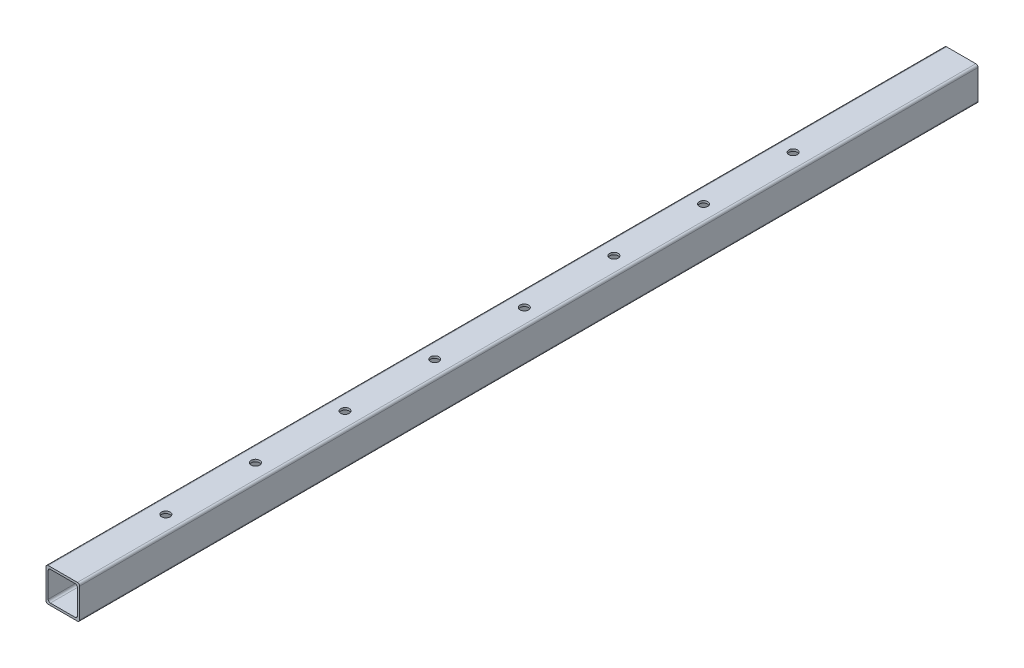
ISO-10303-21;
HEADER;
FILE_DESCRIPTION(('STEP AP214'),'2;1');
FILE_NAME('part.step','',(''),(''),'','','');
FILE_SCHEMA(('AUTOMOTIVE_DESIGN { 1 0 10303 214 1 1 1 1 }'));
ENDSEC;
DATA;
#1=APPLICATION_CONTEXT('core data for automotive mechanical design processes');
#2=APPLICATION_PROTOCOL_DEFINITION('international standard','automotive_design',2000,#1);
#3=PRODUCT_CONTEXT('',#1,'mechanical');
#4=PRODUCT('Part','Part','',(#3));
#5=PRODUCT_RELATED_PRODUCT_CATEGORY('part','',(#4));
#6=PRODUCT_DEFINITION_FORMATION('','',#4);
#7=PRODUCT_DEFINITION_CONTEXT('part definition',#1,'design');
#8=PRODUCT_DEFINITION('design','',#6,#7);
#9=PRODUCT_DEFINITION_SHAPE('','',#8);
#10=(LENGTH_UNIT() NAMED_UNIT(*) SI_UNIT(.MILLI.,.METRE.));
#11=(NAMED_UNIT(*) PLANE_ANGLE_UNIT() SI_UNIT($,.RADIAN.));
#12=(NAMED_UNIT(*) SI_UNIT($,.STERADIAN.) SOLID_ANGLE_UNIT());
#13=UNCERTAINTY_MEASURE_WITH_UNIT(LENGTH_MEASURE(1.E-05),#10,'distance_accuracy_value','');
#14=(GEOMETRIC_REPRESENTATION_CONTEXT(3) GLOBAL_UNCERTAINTY_ASSIGNED_CONTEXT((#13)) GLOBAL_UNIT_ASSIGNED_CONTEXT((#10,
#11,#12)) REPRESENTATION_CONTEXT('',''));
#15=CARTESIAN_POINT('',(0.,0.,0.));
#16=DIRECTION('',(0.,0.,1.));
#17=DIRECTION('',(1.,0.,0.));
#18=AXIS2_PLACEMENT_3D('',#15,#16,#17);
#19=CARTESIAN_POINT('',(0.,0.,254.635));
#20=DIRECTION('',(0.,0.,1.));
#21=DIRECTION('',(1.,0.,0.));
#22=AXIS2_PLACEMENT_3D('',#19,#20,#21);
#23=PLANE('',#22);
#24=DIRECTION('',(-1.,0.,0.));
#25=VECTOR('',#24,1.);
#26=CARTESIAN_POINT('',(9.525,9.525,254.635));
#27=LINE('',#26,#25);
#28=CARTESIAN_POINT('',(8.2804,9.525,254.635));
#29=VERTEX_POINT('',#28);
#30=CARTESIAN_POINT('',(-8.28039999999999,9.525,254.635));
#31=VERTEX_POINT('',#30);
#32=EDGE_CURVE('E296',#29,#31,#27,.T.);
#33=ORIENTED_EDGE('',*,*,#32,.T.);
#34=CARTESIAN_POINT('',(-8.2804,8.2804,254.635));
#35=DIRECTION('',(0.,0.,1.));
#36=DIRECTION('',(1.,0.,0.));
#37=AXIS2_PLACEMENT_3D('',#34,#35,#36);
#38=CIRCLE('',#37,1.2446);
#39=CARTESIAN_POINT('',(-9.525,8.2804,254.635));
#40=VERTEX_POINT('',#39);
#41=EDGE_CURVE('E215',#31,#40,#38,.T.);
#42=ORIENTED_EDGE('',*,*,#41,.T.);
#43=DIRECTION('',(0.,-1.,0.));
#44=VECTOR('',#43,1.);
#45=CARTESIAN_POINT('',(-9.525,9.525,254.635));
#46=LINE('',#45,#44);
#47=CARTESIAN_POINT('',(-9.525,-8.2804,254.635));
#48=VERTEX_POINT('',#47);
#49=EDGE_CURVE('E183',#40,#48,#46,.T.);
#50=ORIENTED_EDGE('',*,*,#49,.T.);
#51=CARTESIAN_POINT('',(-8.2804,-8.2804,254.635));
#52=DIRECTION('',(0.,0.,1.));
#53=DIRECTION('',(1.,0.,0.));
#54=AXIS2_PLACEMENT_3D('',#51,#52,#53);
#55=CIRCLE('',#54,1.2446);
#56=CARTESIAN_POINT('',(-8.2804,-9.525,254.635));
#57=VERTEX_POINT('',#56);
#58=EDGE_CURVE('E211',#48,#57,#55,.T.);
#59=ORIENTED_EDGE('',*,*,#58,.T.);
#60=DIRECTION('',(1.,0.,0.));
#61=VECTOR('',#60,1.);
#62=CARTESIAN_POINT('',(-9.525,-9.525,254.635));
#63=LINE('',#62,#61);
#64=CARTESIAN_POINT('',(8.28039999999999,-9.525,254.635));
#65=VERTEX_POINT('',#64);
#66=EDGE_CURVE('E201',#57,#65,#63,.T.);
#67=ORIENTED_EDGE('',*,*,#66,.T.);
#68=CARTESIAN_POINT('',(8.2804,-8.2804,254.635));
#69=DIRECTION('',(0.,0.,1.));
#70=DIRECTION('',(1.,0.,0.));
#71=AXIS2_PLACEMENT_3D('',#68,#69,#70);
#72=CIRCLE('',#71,1.2446);
#73=CARTESIAN_POINT('',(9.525,-8.2804,254.635));
#74=VERTEX_POINT('',#73);
#75=EDGE_CURVE('E213',#65,#74,#72,.T.);
#76=ORIENTED_EDGE('',*,*,#75,.T.);
#77=DIRECTION('',(0.,1.,0.));
#78=VECTOR('',#77,1.);
#79=CARTESIAN_POINT('',(9.525,-9.525,254.635));
#80=LINE('',#79,#78);
#81=CARTESIAN_POINT('',(9.525,8.2804,254.635));
#82=VERTEX_POINT('',#81);
#83=EDGE_CURVE('E195',#74,#82,#80,.T.);
#84=ORIENTED_EDGE('',*,*,#83,.T.);
#85=CARTESIAN_POINT('',(8.2804,8.2804,254.635));
#86=DIRECTION('',(0.,0.,1.));
#87=DIRECTION('',(1.,0.,0.));
#88=AXIS2_PLACEMENT_3D('',#85,#86,#87);
#89=CIRCLE('',#88,1.2446);
#90=EDGE_CURVE('E209',#82,#29,#89,.T.);
#91=ORIENTED_EDGE('',*,*,#90,.T.);
#92=EDGE_LOOP('',(#33,#42,#50,#59,#67,#76,#84,#91));
#93=FACE_BOUND('',#92,.T.);
#94=DIRECTION('',(0.,1.,0.));
#95=VECTOR('',#94,1.);
#96=CARTESIAN_POINT('',(8.2804,8.2804,254.635));
#97=LINE('',#96,#95);
#98=CARTESIAN_POINT('',(8.2804,-7.0358,254.635));
#99=VERTEX_POINT('',#98);
#100=CARTESIAN_POINT('',(8.2804,7.0358,254.635));
#101=VERTEX_POINT('',#100);
#102=EDGE_CURVE('E272',#99,#101,#97,.T.);
#103=ORIENTED_EDGE('',*,*,#102,.F.);
#104=CARTESIAN_POINT('',(7.0358,-7.0358,254.635));
#105=DIRECTION('',(0.,0.,1.));
#106=DIRECTION('',(1.,0.,0.));
#107=AXIS2_PLACEMENT_3D('',#104,#105,#106);
#108=CIRCLE('',#107,1.2446);
#109=CARTESIAN_POINT('',(7.0358,-8.2804,254.635));
#110=VERTEX_POINT('',#109);
#111=EDGE_CURVE('E248',#99,#110,#108,.F.);
#112=ORIENTED_EDGE('',*,*,#111,.T.);
#113=DIRECTION('',(1.,0.,0.));
#114=VECTOR('',#113,1.);
#115=CARTESIAN_POINT('',(8.2804,-8.2804,254.635));
#116=LINE('',#115,#114);
#117=CARTESIAN_POINT('',(-7.0358,-8.2804,254.635));
#118=VERTEX_POINT('',#117);
#119=EDGE_CURVE('E278',#118,#110,#116,.T.);
#120=ORIENTED_EDGE('',*,*,#119,.F.);
#121=CARTESIAN_POINT('',(-7.0358,-7.0358,254.635));
#122=DIRECTION('',(0.,0.,1.));
#123=DIRECTION('',(1.,0.,0.));
#124=AXIS2_PLACEMENT_3D('',#121,#122,#123);
#125=CIRCLE('',#124,1.2446);
#126=CARTESIAN_POINT('',(-8.2804,-7.0358,254.635));
#127=VERTEX_POINT('',#126);
#128=EDGE_CURVE('E252',#118,#127,#125,.F.);
#129=ORIENTED_EDGE('',*,*,#128,.T.);
#130=DIRECTION('',(0.,-1.,0.));
#131=VECTOR('',#130,1.);
#132=CARTESIAN_POINT('',(-8.2804,-8.2804,254.635));
#133=LINE('',#132,#131);
#134=CARTESIAN_POINT('',(-8.2804,7.0358,254.635));
#135=VERTEX_POINT('',#134);
#136=EDGE_CURVE('E280',#135,#127,#133,.T.);
#137=ORIENTED_EDGE('',*,*,#136,.F.);
#138=CARTESIAN_POINT('',(-7.0358,7.0358,254.635));
#139=DIRECTION('',(0.,0.,1.));
#140=DIRECTION('',(1.,0.,0.));
#141=AXIS2_PLACEMENT_3D('',#138,#139,#140);
#142=CIRCLE('',#141,1.2446);
#143=CARTESIAN_POINT('',(-7.0358,8.2804,254.635));
#144=VERTEX_POINT('',#143);
#145=EDGE_CURVE('E64',#135,#144,#142,.F.);
#146=ORIENTED_EDGE('',*,*,#145,.T.);
#147=DIRECTION('',(-1.,0.,0.));
#148=VECTOR('',#147,1.);
#149=CARTESIAN_POINT('',(-8.2804,8.2804,254.635));
#150=LINE('',#149,#148);
#151=CARTESIAN_POINT('',(7.0358,8.2804,254.635));
#152=VERTEX_POINT('',#151);
#153=EDGE_CURVE('E274',#152,#144,#150,.T.);
#154=ORIENTED_EDGE('',*,*,#153,.F.);
#155=CARTESIAN_POINT('',(7.0358,7.0358,254.635));
#156=DIRECTION('',(0.,0.,1.));
#157=DIRECTION('',(1.,0.,0.));
#158=AXIS2_PLACEMENT_3D('',#155,#156,#157);
#159=CIRCLE('',#158,1.2446);
#160=EDGE_CURVE('E11',#152,#101,#159,.F.);
#161=ORIENTED_EDGE('',*,*,#160,.T.);
#162=EDGE_LOOP('',(#103,#112,#120,#129,#137,#146,#154,#161));
#163=FACE_BOUND('',#162,.T.);
#164=ADVANCED_FACE('F49',(#93,#163),#23,.T.);
#165=CARTESIAN_POINT('',(0.,0.,-254.635));
#166=DIRECTION('',(0.,0.,1.));
#167=DIRECTION('',(1.,0.,0.));
#168=AXIS2_PLACEMENT_3D('',#165,#166,#167);
#169=PLANE('',#168);
#170=DIRECTION('',(0.,-1.,0.));
#171=VECTOR('',#170,1.);
#172=CARTESIAN_POINT('',(-9.525,9.525,-254.635));
#173=LINE('',#172,#171);
#174=CARTESIAN_POINT('',(-9.525,8.2804,-254.635));
#175=VERTEX_POINT('',#174);
#176=CARTESIAN_POINT('',(-9.525,-8.2804,-254.635));
#177=VERTEX_POINT('',#176);
#178=EDGE_CURVE('E180',#175,#177,#173,.T.);
#179=ORIENTED_EDGE('',*,*,#178,.F.);
#180=CARTESIAN_POINT('',(-8.2804,8.2804,-254.635));
#181=DIRECTION('',(0.,0.,1.));
#182=DIRECTION('',(1.,0.,0.));
#183=AXIS2_PLACEMENT_3D('',#180,#181,#182);
#184=CIRCLE('',#183,1.2446);
#185=CARTESIAN_POINT('',(-8.28039999999999,9.525,-254.635));
#186=VERTEX_POINT('',#185);
#187=EDGE_CURVE('E163',#175,#186,#184,.F.);
#188=ORIENTED_EDGE('',*,*,#187,.T.);
#189=DIRECTION('',(-1.,0.,0.));
#190=VECTOR('',#189,1.);
#191=CARTESIAN_POINT('',(9.525,9.525,-254.635));
#192=LINE('',#191,#190);
#193=CARTESIAN_POINT('',(8.2804,9.525,-254.635));
#194=VERTEX_POINT('',#193);
#195=EDGE_CURVE('E192',#194,#186,#192,.T.);
#196=ORIENTED_EDGE('',*,*,#195,.F.);
#197=CARTESIAN_POINT('',(8.2804,8.2804,-254.635));
#198=DIRECTION('',(0.,0.,1.));
#199=DIRECTION('',(1.,0.,0.));
#200=AXIS2_PLACEMENT_3D('',#197,#198,#199);
#201=CIRCLE('',#200,1.2446);
#202=CARTESIAN_POINT('',(9.525,8.2804,-254.635));
#203=VERTEX_POINT('',#202);
#204=EDGE_CURVE('E184',#194,#203,#201,.F.);
#205=ORIENTED_EDGE('',*,*,#204,.T.);
#206=DIRECTION('',(0.,1.,0.));
#207=VECTOR('',#206,1.);
#208=CARTESIAN_POINT('',(9.525,-9.525,-254.635));
#209=LINE('',#208,#207);
#210=CARTESIAN_POINT('',(9.525,-8.2804,-254.635));
#211=VERTEX_POINT('',#210);
#212=EDGE_CURVE('E197',#211,#203,#209,.T.);
#213=ORIENTED_EDGE('',*,*,#212,.F.);
#214=CARTESIAN_POINT('',(8.2804,-8.2804,-254.635));
#215=DIRECTION('',(0.,0.,1.));
#216=DIRECTION('',(1.,0.,0.));
#217=AXIS2_PLACEMENT_3D('',#214,#215,#216);
#218=CIRCLE('',#217,1.2446);
#219=CARTESIAN_POINT('',(8.28039999999999,-9.525,-254.635));
#220=VERTEX_POINT('',#219);
#221=EDGE_CURVE('E174',#211,#220,#218,.F.);
#222=ORIENTED_EDGE('',*,*,#221,.T.);
#223=DIRECTION('',(1.,0.,0.));
#224=VECTOR('',#223,1.);
#225=CARTESIAN_POINT('',(-9.525,-9.525,-254.635));
#226=LINE('',#225,#224);
#227=CARTESIAN_POINT('',(-8.2804,-9.525,-254.635));
#228=VERTEX_POINT('',#227);
#229=EDGE_CURVE('E191',#228,#220,#226,.T.);
#230=ORIENTED_EDGE('',*,*,#229,.F.);
#231=CARTESIAN_POINT('',(-8.2804,-8.2804,-254.635));
#232=DIRECTION('',(0.,0.,1.));
#233=DIRECTION('',(1.,0.,0.));
#234=AXIS2_PLACEMENT_3D('',#231,#232,#233);
#235=CIRCLE('',#234,1.2446);
#236=EDGE_CURVE('E190',#228,#177,#235,.F.);
#237=ORIENTED_EDGE('',*,*,#236,.T.);
#238=EDGE_LOOP('',(#179,#188,#196,#205,#213,#222,#230,#237));
#239=FACE_BOUND('',#238,.T.);
#240=DIRECTION('',(0.,-1.,0.));
#241=VECTOR('',#240,1.);
#242=CARTESIAN_POINT('',(-8.2804,-8.2804,-254.635));
#243=LINE('',#242,#241);
#244=CARTESIAN_POINT('',(-8.2804,7.0358,-254.635));
#245=VERTEX_POINT('',#244);
#246=CARTESIAN_POINT('',(-8.2804,-7.0358,-254.635));
#247=VERTEX_POINT('',#246);
#248=EDGE_CURVE('E266',#245,#247,#243,.T.);
#249=ORIENTED_EDGE('',*,*,#248,.T.);
#250=CARTESIAN_POINT('',(-7.0358,-7.0358,-254.635));
#251=DIRECTION('',(0.,0.,1.));
#252=DIRECTION('',(1.,0.,0.));
#253=AXIS2_PLACEMENT_3D('',#250,#251,#252);
#254=CIRCLE('',#253,1.2446);
#255=CARTESIAN_POINT('',(-7.0358,-8.2804,-254.635));
#256=VERTEX_POINT('',#255);
#257=EDGE_CURVE('E250',#247,#256,#254,.T.);
#258=ORIENTED_EDGE('',*,*,#257,.T.);
#259=DIRECTION('',(1.,0.,0.));
#260=VECTOR('',#259,1.);
#261=CARTESIAN_POINT('',(8.2804,-8.2804,-254.635));
#262=LINE('',#261,#260);
#263=CARTESIAN_POINT('',(7.0358,-8.2804,-254.635));
#264=VERTEX_POINT('',#263);
#265=EDGE_CURVE('E288',#256,#264,#262,.T.);
#266=ORIENTED_EDGE('',*,*,#265,.T.);
#267=CARTESIAN_POINT('',(7.0358,-7.0358,-254.635));
#268=DIRECTION('',(0.,0.,1.));
#269=DIRECTION('',(1.,0.,0.));
#270=AXIS2_PLACEMENT_3D('',#267,#268,#269);
#271=CIRCLE('',#270,1.2446);
#272=CARTESIAN_POINT('',(8.2804,-7.0358,-254.635));
#273=VERTEX_POINT('',#272);
#274=EDGE_CURVE('E246',#264,#273,#271,.T.);
#275=ORIENTED_EDGE('',*,*,#274,.T.);
#276=DIRECTION('',(0.,1.,0.));
#277=VECTOR('',#276,1.);
#278=CARTESIAN_POINT('',(8.2804,8.2804,-254.635));
#279=LINE('',#278,#277);
#280=CARTESIAN_POINT('',(8.2804,7.0358,-254.635));
#281=VERTEX_POINT('',#280);
#282=EDGE_CURVE('E261',#273,#281,#279,.T.);
#283=ORIENTED_EDGE('',*,*,#282,.T.);
#284=CARTESIAN_POINT('',(7.0358,7.0358,-254.635));
#285=DIRECTION('',(0.,0.,1.));
#286=DIRECTION('',(1.,0.,0.));
#287=AXIS2_PLACEMENT_3D('',#284,#285,#286);
#288=CIRCLE('',#287,1.2446);
#289=CARTESIAN_POINT('',(7.0358,8.2804,-254.635));
#290=VERTEX_POINT('',#289);
#291=EDGE_CURVE('E57',#281,#290,#288,.T.);
#292=ORIENTED_EDGE('',*,*,#291,.T.);
#293=DIRECTION('',(-1.,0.,0.));
#294=VECTOR('',#293,1.);
#295=CARTESIAN_POINT('',(-8.2804,8.2804,-254.635));
#296=LINE('',#295,#294);
#297=CARTESIAN_POINT('',(-7.0358,8.2804,-254.635));
#298=VERTEX_POINT('',#297);
#299=EDGE_CURVE('E259',#290,#298,#296,.T.);
#300=ORIENTED_EDGE('',*,*,#299,.T.);
#301=CARTESIAN_POINT('',(-7.0358,7.0358,-254.635));
#302=DIRECTION('',(0.,0.,1.));
#303=DIRECTION('',(1.,0.,0.));
#304=AXIS2_PLACEMENT_3D('',#301,#302,#303);
#305=CIRCLE('',#304,1.2446);
#306=EDGE_CURVE('E254',#298,#245,#305,.T.);
#307=ORIENTED_EDGE('',*,*,#306,.T.);
#308=EDGE_LOOP('',(#249,#258,#266,#275,#283,#292,#300,#307));
#309=FACE_BOUND('',#308,.T.);
#310=ADVANCED_FACE('F187',(#239,#309),#169,.F.);
#311=CARTESIAN_POINT('',(9.525,-9.525,254.635));
#312=DIRECTION('',(-1.,0.,0.));
#313=DIRECTION('',(0.,0.,1.));
#314=AXIS2_PLACEMENT_3D('',#311,#312,#313);
#315=PLANE('',#314);
#316=ORIENTED_EDGE('',*,*,#83,.F.);
#317=DIRECTION('',(0.,0.,-1.));
#318=VECTOR('',#317,1.);
#319=CARTESIAN_POINT('',(9.525,-8.2804,254.635));
#320=LINE('',#319,#318);
#321=EDGE_CURVE('E238',#74,#211,#320,.T.);
#322=ORIENTED_EDGE('',*,*,#321,.T.);
#323=ORIENTED_EDGE('',*,*,#212,.T.);
#324=DIRECTION('',(0.,0.,-1.));
#325=VECTOR('',#324,1.);
#326=CARTESIAN_POINT('',(9.525,8.2804,254.635));
#327=LINE('',#326,#325);
#328=EDGE_CURVE('E236',#203,#82,#327,.F.);
#329=ORIENTED_EDGE('',*,*,#328,.T.);
#330=EDGE_LOOP('',(#316,#322,#323,#329));
#331=FACE_BOUND('',#330,.T.);
#332=ADVANCED_FACE('F306',(#331),#315,.F.);
#333=CARTESIAN_POINT('',(9.525,9.525,254.635));
#334=DIRECTION('',(0.,-1.,0.));
#335=DIRECTION('',(0.,0.,-1.));
#336=AXIS2_PLACEMENT_3D('',#333,#334,#335);
#337=PLANE('',#336);
#338=CARTESIAN_POINT('',(0.,9.525,-159.385));
#339=DIRECTION('',(0.,1.,0.));
#340=DIRECTION('',(0.,0.,1.));
#341=AXIS2_PLACEMENT_3D('',#338,#339,#340);
#342=CIRCLE('',#341,2.413);
#343=CARTESIAN_POINT('',(0.,9.525,-156.972));
#344=VERTEX_POINT('',#343);
#345=EDGE_CURVE('E291',#344,#344,#342,.T.);
#346=ORIENTED_EDGE('',*,*,#345,.F.);
#347=EDGE_LOOP('',(#346));
#348=FACE_BOUND('',#347,.T.);
#349=CARTESIAN_POINT('',(0.,9.525,-108.585));
#350=DIRECTION('',(0.,1.,0.));
#351=DIRECTION('',(0.,0.,1.));
#352=AXIS2_PLACEMENT_3D('',#349,#350,#351);
#353=CIRCLE('',#352,2.413);
#354=CARTESIAN_POINT('',(0.,9.525,-106.172));
#355=VERTEX_POINT('',#354);
#356=EDGE_CURVE('E613',#355,#355,#353,.T.);
#357=ORIENTED_EDGE('',*,*,#356,.F.);
#358=EDGE_LOOP('',(#357));
#359=FACE_BOUND('',#358,.T.);
#360=CARTESIAN_POINT('',(0.,9.525,-57.785));
#361=DIRECTION('',(0.,1.,0.));
#362=DIRECTION('',(0.,0.,1.));
#363=AXIS2_PLACEMENT_3D('',#360,#361,#362);
#364=CIRCLE('',#363,2.413);
#365=CARTESIAN_POINT('',(0.,9.525,-55.372));
#366=VERTEX_POINT('',#365);
#367=EDGE_CURVE('E619',#366,#366,#364,.T.);
#368=ORIENTED_EDGE('',*,*,#367,.F.);
#369=EDGE_LOOP('',(#368));
#370=FACE_BOUND('',#369,.T.);
#371=CARTESIAN_POINT('',(0.,9.525,-6.985));
#372=DIRECTION('',(0.,1.,0.));
#373=DIRECTION('',(0.,0.,1.));
#374=AXIS2_PLACEMENT_3D('',#371,#372,#373);
#375=CIRCLE('',#374,2.413);
#376=CARTESIAN_POINT('',(0.,9.525,-4.57200000000001));
#377=VERTEX_POINT('',#376);
#378=EDGE_CURVE('E625',#377,#377,#375,.T.);
#379=ORIENTED_EDGE('',*,*,#378,.F.);
#380=EDGE_LOOP('',(#379));
#381=FACE_BOUND('',#380,.T.);
#382=CARTESIAN_POINT('',(0.,9.525,43.815));
#383=DIRECTION('',(0.,1.,0.));
#384=DIRECTION('',(0.,0.,1.));
#385=AXIS2_PLACEMENT_3D('',#382,#383,#384);
#386=CIRCLE('',#385,2.413);
#387=CARTESIAN_POINT('',(0.,9.525,46.228));
#388=VERTEX_POINT('',#387);
#389=EDGE_CURVE('E631',#388,#388,#386,.T.);
#390=ORIENTED_EDGE('',*,*,#389,.F.);
#391=EDGE_LOOP('',(#390));
#392=FACE_BOUND('',#391,.T.);
#393=CARTESIAN_POINT('',(0.,9.525,94.615));
#394=DIRECTION('',(0.,1.,0.));
#395=DIRECTION('',(0.,0.,1.));
#396=AXIS2_PLACEMENT_3D('',#393,#394,#395);
#397=CIRCLE('',#396,2.413);
#398=CARTESIAN_POINT('',(0.,9.525,97.028));
#399=VERTEX_POINT('',#398);
#400=EDGE_CURVE('E637',#399,#399,#397,.T.);
#401=ORIENTED_EDGE('',*,*,#400,.F.);
#402=EDGE_LOOP('',(#401));
#403=FACE_BOUND('',#402,.T.);
#404=CARTESIAN_POINT('',(0.,9.525,145.415));
#405=DIRECTION('',(0.,1.,0.));
#406=DIRECTION('',(0.,0.,1.));
#407=AXIS2_PLACEMENT_3D('',#404,#405,#406);
#408=CIRCLE('',#407,2.413);
#409=CARTESIAN_POINT('',(0.,9.525,147.828));
#410=VERTEX_POINT('',#409);
#411=EDGE_CURVE('E643',#410,#410,#408,.T.);
#412=ORIENTED_EDGE('',*,*,#411,.F.);
#413=EDGE_LOOP('',(#412));
#414=FACE_BOUND('',#413,.T.);
#415=CARTESIAN_POINT('',(0.,9.525,196.215));
#416=DIRECTION('',(0.,1.,0.));
#417=DIRECTION('',(0.,0.,1.));
#418=AXIS2_PLACEMENT_3D('',#415,#416,#417);
#419=CIRCLE('',#418,2.413);
#420=CARTESIAN_POINT('',(0.,9.525,198.628));
#421=VERTEX_POINT('',#420);
#422=EDGE_CURVE('E648',#421,#421,#419,.T.);
#423=ORIENTED_EDGE('',*,*,#422,.F.);
#424=EDGE_LOOP('',(#423));
#425=FACE_BOUND('',#424,.T.);
#426=ORIENTED_EDGE('',*,*,#195,.T.);
#427=DIRECTION('',(0.,0.,-1.));
#428=VECTOR('',#427,1.);
#429=CARTESIAN_POINT('',(-8.2804,9.525,254.635));
#430=LINE('',#429,#428);
#431=EDGE_CURVE('E168',#186,#31,#430,.F.);
#432=ORIENTED_EDGE('',*,*,#431,.T.);
#433=ORIENTED_EDGE('',*,*,#32,.F.);
#434=DIRECTION('',(0.,0.,-1.));
#435=VECTOR('',#434,1.);
#436=CARTESIAN_POINT('',(8.2804,9.525,254.635));
#437=LINE('',#436,#435);
#438=EDGE_CURVE('E173',#29,#194,#437,.T.);
#439=ORIENTED_EDGE('',*,*,#438,.T.);
#440=EDGE_LOOP('',(#426,#432,#433,#439));
#441=FACE_BOUND('',#440,.T.);
#442=ADVANCED_FACE('F314',(#348,#359,#370,#381,#392,#403,#414,#425,#441),#337,.F.);
#443=CARTESIAN_POINT('',(-9.525,9.525,254.635));
#444=DIRECTION('',(1.,0.,0.));
#445=DIRECTION('',(0.,0.,-1.));
#446=AXIS2_PLACEMENT_3D('',#443,#444,#445);
#447=PLANE('',#446);
#448=ORIENTED_EDGE('',*,*,#49,.F.);
#449=DIRECTION('',(0.,0.,-1.));
#450=VECTOR('',#449,1.);
#451=CARTESIAN_POINT('',(-9.525,8.2804,254.635));
#452=LINE('',#451,#450);
#453=EDGE_CURVE('E167',#40,#175,#452,.T.);
#454=ORIENTED_EDGE('',*,*,#453,.T.);
#455=ORIENTED_EDGE('',*,*,#178,.T.);
#456=DIRECTION('',(0.,0.,-1.));
#457=VECTOR('',#456,1.);
#458=CARTESIAN_POINT('',(-9.525,-8.2804,254.635));
#459=LINE('',#458,#457);
#460=EDGE_CURVE('E185',#177,#48,#459,.F.);
#461=ORIENTED_EDGE('',*,*,#460,.T.);
#462=EDGE_LOOP('',(#448,#454,#455,#461));
#463=FACE_BOUND('',#462,.T.);
#464=ADVANCED_FACE('F179',(#463),#447,.F.);
#465=CARTESIAN_POINT('',(-9.525,-9.525,254.635));
#466=DIRECTION('',(0.,1.,0.));
#467=DIRECTION('',(0.,0.,1.));
#468=AXIS2_PLACEMENT_3D('',#465,#466,#467);
#469=PLANE('',#468);
#470=ORIENTED_EDGE('',*,*,#229,.T.);
#471=DIRECTION('',(0.,0.,-1.));
#472=VECTOR('',#471,1.);
#473=CARTESIAN_POINT('',(8.2804,-9.525,254.635));
#474=LINE('',#473,#472);
#475=EDGE_CURVE('E244',#220,#65,#474,.F.);
#476=ORIENTED_EDGE('',*,*,#475,.T.);
#477=ORIENTED_EDGE('',*,*,#66,.F.);
#478=DIRECTION('',(0.,0.,-1.));
#479=VECTOR('',#478,1.);
#480=CARTESIAN_POINT('',(-8.2804,-9.525,254.635));
#481=LINE('',#480,#479);
#482=EDGE_CURVE('E241',#57,#228,#481,.T.);
#483=ORIENTED_EDGE('',*,*,#482,.T.);
#484=EDGE_LOOP('',(#470,#476,#477,#483));
#485=FACE_BOUND('',#484,.T.);
#486=ADVANCED_FACE('F323',(#485),#469,.F.);
#487=CARTESIAN_POINT('',(8.2804,-8.2804,254.635));
#488=DIRECTION('',(0.,1.,0.));
#489=DIRECTION('',(0.,0.,1.));
#490=AXIS2_PLACEMENT_3D('',#487,#488,#489);
#491=PLANE('',#490);
#492=ORIENTED_EDGE('',*,*,#119,.T.);
#493=DIRECTION('',(0.,0.,-1.));
#494=VECTOR('',#493,1.);
#495=CARTESIAN_POINT('',(7.0358,-8.2804,-254.635));
#496=LINE('',#495,#494);
#497=EDGE_CURVE('E219',#110,#264,#496,.T.);
#498=ORIENTED_EDGE('',*,*,#497,.T.);
#499=ORIENTED_EDGE('',*,*,#265,.F.);
#500=DIRECTION('',(0.,0.,-1.));
#501=VECTOR('',#500,1.);
#502=CARTESIAN_POINT('',(-7.0358,-8.2804,254.635));
#503=LINE('',#502,#501);
#504=EDGE_CURVE('E217',#256,#118,#503,.F.);
#505=ORIENTED_EDGE('',*,*,#504,.T.);
#506=EDGE_LOOP('',(#492,#498,#499,#505));
#507=FACE_BOUND('',#506,.T.);
#508=ADVANCED_FACE('F336',(#507),#491,.T.);
#509=CARTESIAN_POINT('',(8.2804,8.2804,254.635));
#510=DIRECTION('',(-1.,0.,0.));
#511=DIRECTION('',(0.,0.,1.));
#512=AXIS2_PLACEMENT_3D('',#509,#510,#511);
#513=PLANE('',#512);
#514=ORIENTED_EDGE('',*,*,#282,.F.);
#515=DIRECTION('',(0.,0.,-1.));
#516=VECTOR('',#515,1.);
#517=CARTESIAN_POINT('',(8.2804,-7.0358,254.635));
#518=LINE('',#517,#516);
#519=EDGE_CURVE('E225',#273,#99,#518,.F.);
#520=ORIENTED_EDGE('',*,*,#519,.T.);
#521=ORIENTED_EDGE('',*,*,#102,.T.);
#522=DIRECTION('',(0.,0.,-1.));
#523=VECTOR('',#522,1.);
#524=CARTESIAN_POINT('',(8.2804,7.0358,-254.635));
#525=LINE('',#524,#523);
#526=EDGE_CURVE('E222',#101,#281,#525,.T.);
#527=ORIENTED_EDGE('',*,*,#526,.T.);
#528=EDGE_LOOP('',(#514,#520,#521,#527));
#529=FACE_BOUND('',#528,.T.);
#530=ADVANCED_FACE('F276',(#529),#513,.T.);
#531=CARTESIAN_POINT('',(-8.2804,8.2804,254.635));
#532=DIRECTION('',(0.,-1.,0.));
#533=DIRECTION('',(1.,0.,0.));
#534=AXIS2_PLACEMENT_3D('',#531,#532,#533);
#535=PLANE('',#534);
#536=CARTESIAN_POINT('',(0.,8.2804,-159.385));
#537=DIRECTION('',(0.,-1.,0.));
#538=DIRECTION('',(1.,0.,0.));
#539=AXIS2_PLACEMENT_3D('',#536,#537,#538);
#540=CIRCLE('',#539,2.413);
#541=CARTESIAN_POINT('',(2.41300000000001,8.2804,-159.385));
#542=VERTEX_POINT('',#541);
#543=EDGE_CURVE('E605',#542,#542,#540,.F.);
#544=ORIENTED_EDGE('',*,*,#543,.T.);
#545=EDGE_LOOP('',(#544));
#546=FACE_BOUND('',#545,.T.);
#547=CARTESIAN_POINT('',(0.,8.2804,-108.585));
#548=DIRECTION('',(0.,-1.,0.));
#549=DIRECTION('',(1.,0.,0.));
#550=AXIS2_PLACEMENT_3D('',#547,#548,#549);
#551=CIRCLE('',#550,2.413);
#552=CARTESIAN_POINT('',(2.41300000000001,8.2804,-108.585));
#553=VERTEX_POINT('',#552);
#554=EDGE_CURVE('E608',#553,#553,#551,.F.);
#555=ORIENTED_EDGE('',*,*,#554,.T.);
#556=EDGE_LOOP('',(#555));
#557=FACE_BOUND('',#556,.T.);
#558=CARTESIAN_POINT('',(0.,8.2804,-57.785));
#559=DIRECTION('',(0.,-1.,0.));
#560=DIRECTION('',(1.,0.,0.));
#561=AXIS2_PLACEMENT_3D('',#558,#559,#560);
#562=CIRCLE('',#561,2.413);
#563=CARTESIAN_POINT('',(2.413,8.2804,-57.785));
#564=VERTEX_POINT('',#563);
#565=EDGE_CURVE('E616',#564,#564,#562,.F.);
#566=ORIENTED_EDGE('',*,*,#565,.T.);
#567=EDGE_LOOP('',(#566));
#568=FACE_BOUND('',#567,.T.);
#569=CARTESIAN_POINT('',(0.,8.2804,-6.985));
#570=DIRECTION('',(0.,-1.,0.));
#571=DIRECTION('',(1.,0.,0.));
#572=AXIS2_PLACEMENT_3D('',#569,#570,#571);
#573=CIRCLE('',#572,2.413);
#574=CARTESIAN_POINT('',(2.41299999999999,8.2804,-6.985));
#575=VERTEX_POINT('',#574);
#576=EDGE_CURVE('E622',#575,#575,#573,.F.);
#577=ORIENTED_EDGE('',*,*,#576,.T.);
#578=EDGE_LOOP('',(#577));
#579=FACE_BOUND('',#578,.T.);
#580=CARTESIAN_POINT('',(0.,8.2804,43.815));
#581=DIRECTION('',(0.,-1.,0.));
#582=DIRECTION('',(1.,0.,0.));
#583=AXIS2_PLACEMENT_3D('',#580,#581,#582);
#584=CIRCLE('',#583,2.413);
#585=CARTESIAN_POINT('',(2.41299999999999,8.2804,43.815));
#586=VERTEX_POINT('',#585);
#587=EDGE_CURVE('E628',#586,#586,#584,.F.);
#588=ORIENTED_EDGE('',*,*,#587,.T.);
#589=EDGE_LOOP('',(#588));
#590=FACE_BOUND('',#589,.T.);
#591=CARTESIAN_POINT('',(0.,8.2804,94.615));
#592=DIRECTION('',(0.,-1.,0.));
#593=DIRECTION('',(1.,0.,0.));
#594=AXIS2_PLACEMENT_3D('',#591,#592,#593);
#595=CIRCLE('',#594,2.413);
#596=CARTESIAN_POINT('',(2.41299999999998,8.2804,94.615));
#597=VERTEX_POINT('',#596);
#598=EDGE_CURVE('E634',#597,#597,#595,.F.);
#599=ORIENTED_EDGE('',*,*,#598,.T.);
#600=EDGE_LOOP('',(#599));
#601=FACE_BOUND('',#600,.T.);
#602=CARTESIAN_POINT('',(0.,8.2804,145.415));
#603=DIRECTION('',(0.,-1.,0.));
#604=DIRECTION('',(1.,0.,0.));
#605=AXIS2_PLACEMENT_3D('',#602,#603,#604);
#606=CIRCLE('',#605,2.413);
#607=CARTESIAN_POINT('',(2.41299999999998,8.2804,145.415));
#608=VERTEX_POINT('',#607);
#609=EDGE_CURVE('E640',#608,#608,#606,.F.);
#610=ORIENTED_EDGE('',*,*,#609,.T.);
#611=EDGE_LOOP('',(#610));
#612=FACE_BOUND('',#611,.T.);
#613=CARTESIAN_POINT('',(0.,8.2804,196.215));
#614=DIRECTION('',(0.,-1.,0.));
#615=DIRECTION('',(1.,0.,0.));
#616=AXIS2_PLACEMENT_3D('',#613,#614,#615);
#617=CIRCLE('',#616,2.413);
#618=CARTESIAN_POINT('',(2.41299999999998,8.2804,196.215));
#619=VERTEX_POINT('',#618);
#620=EDGE_CURVE('E646',#619,#619,#617,.F.);
#621=ORIENTED_EDGE('',*,*,#620,.T.);
#622=EDGE_LOOP('',(#621));
#623=FACE_BOUND('',#622,.T.);
#624=ORIENTED_EDGE('',*,*,#153,.T.);
#625=DIRECTION('',(0.,0.,-1.));
#626=VECTOR('',#625,1.);
#627=CARTESIAN_POINT('',(-7.0358,8.2804,-254.635));
#628=LINE('',#627,#626);
#629=EDGE_CURVE('E233',#144,#298,#628,.T.);
#630=ORIENTED_EDGE('',*,*,#629,.T.);
#631=ORIENTED_EDGE('',*,*,#299,.F.);
#632=DIRECTION('',(0.,0.,-1.));
#633=VECTOR('',#632,1.);
#634=CARTESIAN_POINT('',(7.0358,8.2804,254.635));
#635=LINE('',#634,#633);
#636=EDGE_CURVE('E71',#290,#152,#635,.F.);
#637=ORIENTED_EDGE('',*,*,#636,.T.);
#638=EDGE_LOOP('',(#624,#630,#631,#637));
#639=FACE_BOUND('',#638,.T.);
#640=ADVANCED_FACE('F264',(#546,#557,#568,#579,#590,#601,#612,#623,#639),#535,.T.);
#641=CARTESIAN_POINT('',(-8.2804,-8.2804,254.635));
#642=DIRECTION('',(1.,0.,0.));
#643=DIRECTION('',(0.,1.,0.));
#644=AXIS2_PLACEMENT_3D('',#641,#642,#643);
#645=PLANE('',#644);
#646=ORIENTED_EDGE('',*,*,#136,.T.);
#647=DIRECTION('',(0.,0.,-1.));
#648=VECTOR('',#647,1.);
#649=CARTESIAN_POINT('',(-8.2804,-7.0358,-254.635));
#650=LINE('',#649,#648);
#651=EDGE_CURVE('E229',#127,#247,#650,.T.);
#652=ORIENTED_EDGE('',*,*,#651,.T.);
#653=ORIENTED_EDGE('',*,*,#248,.F.);
#654=DIRECTION('',(0.,0.,-1.));
#655=VECTOR('',#654,1.);
#656=CARTESIAN_POINT('',(-8.2804,7.0358,254.635));
#657=LINE('',#656,#655);
#658=EDGE_CURVE('E227',#245,#135,#657,.F.);
#659=ORIENTED_EDGE('',*,*,#658,.T.);
#660=EDGE_LOOP('',(#646,#652,#653,#659));
#661=FACE_BOUND('',#660,.T.);
#662=ADVANCED_FACE('F377',(#661),#645,.T.);
#663=CARTESIAN_POINT('',(-8.2804,8.2804,254.635));
#664=DIRECTION('',(0.,0.,-1.));
#665=DIRECTION('',(-1.,0.,0.));
#666=AXIS2_PLACEMENT_3D('',#663,#664,#665);
#667=CYLINDRICAL_SURFACE('',#666,1.2446);
#668=ORIENTED_EDGE('',*,*,#41,.F.);
#669=ORIENTED_EDGE('',*,*,#431,.F.);
#670=ORIENTED_EDGE('',*,*,#187,.F.);
#671=ORIENTED_EDGE('',*,*,#453,.F.);
#672=EDGE_LOOP('',(#668,#669,#670,#671));
#673=FACE_BOUND('',#672,.T.);
#674=ADVANCED_FACE('F166',(#673),#667,.T.);
#675=CARTESIAN_POINT('',(7.0358,-7.0358,254.635));
#676=DIRECTION('',(0.,0.,1.));
#677=DIRECTION('',(1.,0.,0.));
#678=AXIS2_PLACEMENT_3D('',#675,#676,#677);
#679=CYLINDRICAL_SURFACE('',#678,1.2446);
#680=ORIENTED_EDGE('',*,*,#111,.F.);
#681=ORIENTED_EDGE('',*,*,#519,.F.);
#682=ORIENTED_EDGE('',*,*,#274,.F.);
#683=ORIENTED_EDGE('',*,*,#497,.F.);
#684=EDGE_LOOP('',(#680,#681,#682,#683));
#685=FACE_BOUND('',#684,.T.);
#686=ADVANCED_FACE('F371',(#685),#679,.F.);
#687=CARTESIAN_POINT('',(-7.0358,-7.0358,254.635));
#688=DIRECTION('',(0.,0.,1.));
#689=DIRECTION('',(1.,0.,0.));
#690=AXIS2_PLACEMENT_3D('',#687,#688,#689);
#691=CYLINDRICAL_SURFACE('',#690,1.2446);
#692=ORIENTED_EDGE('',*,*,#128,.F.);
#693=ORIENTED_EDGE('',*,*,#504,.F.);
#694=ORIENTED_EDGE('',*,*,#257,.F.);
#695=ORIENTED_EDGE('',*,*,#651,.F.);
#696=EDGE_LOOP('',(#692,#693,#694,#695));
#697=FACE_BOUND('',#696,.T.);
#698=ADVANCED_FACE('F367',(#697),#691,.F.);
#699=CARTESIAN_POINT('',(-7.0358,7.0358,254.635));
#700=DIRECTION('',(0.,0.,1.));
#701=DIRECTION('',(1.,0.,0.));
#702=AXIS2_PLACEMENT_3D('',#699,#700,#701);
#703=CYLINDRICAL_SURFACE('',#702,1.2446);
#704=ORIENTED_EDGE('',*,*,#145,.F.);
#705=ORIENTED_EDGE('',*,*,#658,.F.);
#706=ORIENTED_EDGE('',*,*,#306,.F.);
#707=ORIENTED_EDGE('',*,*,#629,.F.);
#708=EDGE_LOOP('',(#704,#705,#706,#707));
#709=FACE_BOUND('',#708,.T.);
#710=ADVANCED_FACE('F364',(#709),#703,.F.);
#711=CARTESIAN_POINT('',(7.0358,7.0358,254.635));
#712=DIRECTION('',(0.,0.,1.));
#713=DIRECTION('',(1.,0.,0.));
#714=AXIS2_PLACEMENT_3D('',#711,#712,#713);
#715=CYLINDRICAL_SURFACE('',#714,1.2446);
#716=ORIENTED_EDGE('',*,*,#160,.F.);
#717=ORIENTED_EDGE('',*,*,#636,.F.);
#718=ORIENTED_EDGE('',*,*,#291,.F.);
#719=ORIENTED_EDGE('',*,*,#526,.F.);
#720=EDGE_LOOP('',(#716,#717,#718,#719));
#721=FACE_BOUND('',#720,.T.);
#722=ADVANCED_FACE('F269',(#721),#715,.F.);
#723=CARTESIAN_POINT('',(8.2804,-8.2804,254.635));
#724=DIRECTION('',(0.,0.,-1.));
#725=DIRECTION('',(-1.,0.,0.));
#726=AXIS2_PLACEMENT_3D('',#723,#724,#725);
#727=CYLINDRICAL_SURFACE('',#726,1.2446);
#728=ORIENTED_EDGE('',*,*,#75,.F.);
#729=ORIENTED_EDGE('',*,*,#475,.F.);
#730=ORIENTED_EDGE('',*,*,#221,.F.);
#731=ORIENTED_EDGE('',*,*,#321,.F.);
#732=EDGE_LOOP('',(#728,#729,#730,#731));
#733=FACE_BOUND('',#732,.T.);
#734=ADVANCED_FACE('F350',(#733),#727,.T.);
#735=CARTESIAN_POINT('',(-8.2804,-8.2804,254.635));
#736=DIRECTION('',(0.,0.,-1.));
#737=DIRECTION('',(-1.,0.,0.));
#738=AXIS2_PLACEMENT_3D('',#735,#736,#737);
#739=CYLINDRICAL_SURFACE('',#738,1.2446);
#740=ORIENTED_EDGE('',*,*,#58,.F.);
#741=ORIENTED_EDGE('',*,*,#460,.F.);
#742=ORIENTED_EDGE('',*,*,#236,.F.);
#743=ORIENTED_EDGE('',*,*,#482,.F.);
#744=EDGE_LOOP('',(#740,#741,#742,#743));
#745=FACE_BOUND('',#744,.T.);
#746=ADVANCED_FACE('F353',(#745),#739,.T.);
#747=CARTESIAN_POINT('',(8.2804,8.2804,254.635));
#748=DIRECTION('',(0.,0.,-1.));
#749=DIRECTION('',(-1.,0.,0.));
#750=AXIS2_PLACEMENT_3D('',#747,#748,#749);
#751=CYLINDRICAL_SURFACE('',#750,1.2446);
#752=ORIENTED_EDGE('',*,*,#90,.F.);
#753=ORIENTED_EDGE('',*,*,#328,.F.);
#754=ORIENTED_EDGE('',*,*,#204,.F.);
#755=ORIENTED_EDGE('',*,*,#438,.F.);
#756=EDGE_LOOP('',(#752,#753,#754,#755));
#757=FACE_BOUND('',#756,.T.);
#758=ADVANCED_FACE('F51',(#757),#751,.T.);
#759=CARTESIAN_POINT('',(0.,-9.526,196.215));
#760=DIRECTION('',(0.,1.,0.));
#761=DIRECTION('',(0.,0.,1.));
#762=AXIS2_PLACEMENT_3D('',#759,#760,#761);
#763=CYLINDRICAL_SURFACE('',#762,2.413);
#764=ORIENTED_EDGE('',*,*,#620,.F.);
#765=EDGE_LOOP('',(#764));
#766=FACE_BOUND('',#765,.T.);
#767=ORIENTED_EDGE('',*,*,#422,.T.);
#768=EDGE_LOOP('',(#767));
#769=FACE_BOUND('',#768,.T.);
#770=ADVANCED_FACE('F359',(#766,#769),#763,.F.);
#771=CARTESIAN_POINT('',(0.,-9.526,145.415));
#772=DIRECTION('',(0.,1.,0.));
#773=DIRECTION('',(0.,0.,1.));
#774=AXIS2_PLACEMENT_3D('',#771,#772,#773);
#775=CYLINDRICAL_SURFACE('',#774,2.413);
#776=ORIENTED_EDGE('',*,*,#609,.F.);
#777=EDGE_LOOP('',(#776));
#778=FACE_BOUND('',#777,.T.);
#779=ORIENTED_EDGE('',*,*,#411,.T.);
#780=EDGE_LOOP('',(#779));
#781=FACE_BOUND('',#780,.T.);
#782=ADVANCED_FACE('F408',(#778,#781),#775,.F.);
#783=CARTESIAN_POINT('',(0.,-9.526,94.615));
#784=DIRECTION('',(0.,1.,0.));
#785=DIRECTION('',(0.,0.,1.));
#786=AXIS2_PLACEMENT_3D('',#783,#784,#785);
#787=CYLINDRICAL_SURFACE('',#786,2.413);
#788=ORIENTED_EDGE('',*,*,#598,.F.);
#789=EDGE_LOOP('',(#788));
#790=FACE_BOUND('',#789,.T.);
#791=ORIENTED_EDGE('',*,*,#400,.T.);
#792=EDGE_LOOP('',(#791));
#793=FACE_BOUND('',#792,.T.);
#794=ADVANCED_FACE('F417',(#790,#793),#787,.F.);
#795=CARTESIAN_POINT('',(0.,-9.526,43.815));
#796=DIRECTION('',(0.,1.,0.));
#797=DIRECTION('',(0.,0.,1.));
#798=AXIS2_PLACEMENT_3D('',#795,#796,#797);
#799=CYLINDRICAL_SURFACE('',#798,2.413);
#800=ORIENTED_EDGE('',*,*,#587,.F.);
#801=EDGE_LOOP('',(#800));
#802=FACE_BOUND('',#801,.T.);
#803=ORIENTED_EDGE('',*,*,#389,.T.);
#804=EDGE_LOOP('',(#803));
#805=FACE_BOUND('',#804,.T.);
#806=ADVANCED_FACE('F425',(#802,#805),#799,.F.);
#807=CARTESIAN_POINT('',(0.,-9.526,-6.985));
#808=DIRECTION('',(0.,1.,0.));
#809=DIRECTION('',(0.,0.,1.));
#810=AXIS2_PLACEMENT_3D('',#807,#808,#809);
#811=CYLINDRICAL_SURFACE('',#810,2.413);
#812=ORIENTED_EDGE('',*,*,#576,.F.);
#813=EDGE_LOOP('',(#812));
#814=FACE_BOUND('',#813,.T.);
#815=ORIENTED_EDGE('',*,*,#378,.T.);
#816=EDGE_LOOP('',(#815));
#817=FACE_BOUND('',#816,.T.);
#818=ADVANCED_FACE('F434',(#814,#817),#811,.F.);
#819=CARTESIAN_POINT('',(0.,-9.526,-57.785));
#820=DIRECTION('',(0.,1.,0.));
#821=DIRECTION('',(0.,0.,1.));
#822=AXIS2_PLACEMENT_3D('',#819,#820,#821);
#823=CYLINDRICAL_SURFACE('',#822,2.413);
#824=ORIENTED_EDGE('',*,*,#565,.F.);
#825=EDGE_LOOP('',(#824));
#826=FACE_BOUND('',#825,.T.);
#827=ORIENTED_EDGE('',*,*,#367,.T.);
#828=EDGE_LOOP('',(#827));
#829=FACE_BOUND('',#828,.T.);
#830=ADVANCED_FACE('F443',(#826,#829),#823,.F.);
#831=CARTESIAN_POINT('',(0.,-9.526,-108.585));
#832=DIRECTION('',(0.,1.,0.));
#833=DIRECTION('',(0.,0.,1.));
#834=AXIS2_PLACEMENT_3D('',#831,#832,#833);
#835=CYLINDRICAL_SURFACE('',#834,2.413);
#836=ORIENTED_EDGE('',*,*,#554,.F.);
#837=EDGE_LOOP('',(#836));
#838=FACE_BOUND('',#837,.T.);
#839=ORIENTED_EDGE('',*,*,#356,.T.);
#840=EDGE_LOOP('',(#839));
#841=FACE_BOUND('',#840,.T.);
#842=ADVANCED_FACE('F452',(#838,#841),#835,.F.);
#843=CARTESIAN_POINT('',(0.,-9.526,-159.385));
#844=DIRECTION('',(0.,1.,0.));
#845=DIRECTION('',(0.,0.,1.));
#846=AXIS2_PLACEMENT_3D('',#843,#844,#845);
#847=CYLINDRICAL_SURFACE('',#846,2.413);
#848=ORIENTED_EDGE('',*,*,#543,.F.);
#849=EDGE_LOOP('',(#848));
#850=FACE_BOUND('',#849,.T.);
#851=ORIENTED_EDGE('',*,*,#345,.T.);
#852=EDGE_LOOP('',(#851));
#853=FACE_BOUND('',#852,.T.);
#854=ADVANCED_FACE('F461',(#850,#853),#847,.F.);
#855=CLOSED_SHELL('',(#164,#310,#332,#442,#464,#486,#508,#530,#640,#662,#674,#686,#698,#710,
#722,#734,#746,#758,#770,#782,#794,#806,#818,#830,#842,#854));
#856=MANIFOLD_SOLID_BREP('B2',#855);
#857=ADVANCED_BREP_SHAPE_REPRESENTATION('',(#18,#856),#14);
#858=SHAPE_DEFINITION_REPRESENTATION(#9,#857);
ENDSEC;
END-ISO-10303-21;
